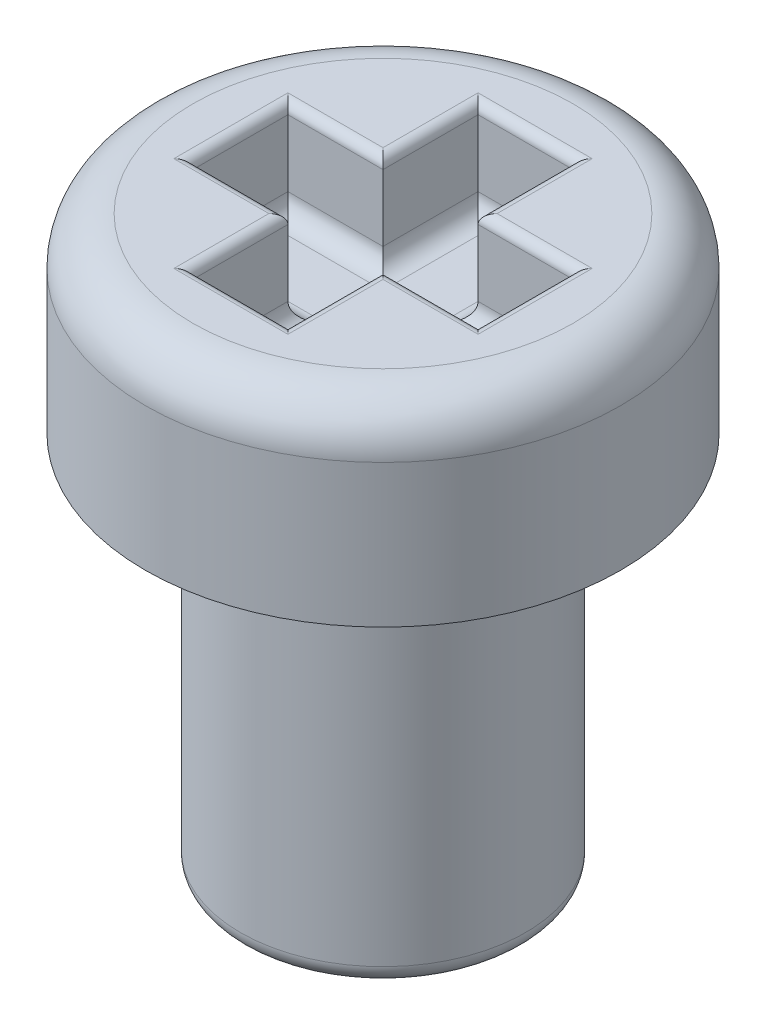
ISO-10303-21;
HEADER;
FILE_DESCRIPTION(('STEP AP214'),'2;1');
FILE_NAME('part.step','',(''),(''),'','','');
FILE_SCHEMA(('AUTOMOTIVE_DESIGN { 1 0 10303 214 1 1 1 1 }'));
ENDSEC;
DATA;
#1=APPLICATION_CONTEXT('core data for automotive mechanical design processes');
#2=APPLICATION_PROTOCOL_DEFINITION('international standard','automotive_design',2000,#1);
#3=PRODUCT_CONTEXT('',#1,'mechanical');
#4=PRODUCT('Part','Part','',(#3));
#5=PRODUCT_RELATED_PRODUCT_CATEGORY('part','',(#4));
#6=PRODUCT_DEFINITION_FORMATION('','',#4);
#7=PRODUCT_DEFINITION_CONTEXT('part definition',#1,'design');
#8=PRODUCT_DEFINITION('design','',#6,#7);
#9=PRODUCT_DEFINITION_SHAPE('','',#8);
#10=(LENGTH_UNIT() NAMED_UNIT(*) SI_UNIT(.MILLI.,.METRE.));
#11=(NAMED_UNIT(*) PLANE_ANGLE_UNIT() SI_UNIT($,.RADIAN.));
#12=(NAMED_UNIT(*) SI_UNIT($,.STERADIAN.) SOLID_ANGLE_UNIT());
#13=UNCERTAINTY_MEASURE_WITH_UNIT(LENGTH_MEASURE(1.E-05),#10,'distance_accuracy_value','');
#14=(GEOMETRIC_REPRESENTATION_CONTEXT(3) GLOBAL_UNCERTAINTY_ASSIGNED_CONTEXT((#13)) GLOBAL_UNIT_ASSIGNED_CONTEXT((#10,
#11,#12)) REPRESENTATION_CONTEXT('',''));
#15=CARTESIAN_POINT('',(0.,0.,0.));
#16=DIRECTION('',(0.,0.,1.));
#17=DIRECTION('',(1.,0.,0.));
#18=AXIS2_PLACEMENT_3D('',#15,#16,#17);
#19=CARTESIAN_POINT('',(0.,4.,0.));
#20=DIRECTION('',(0.,-1.,0.));
#21=DIRECTION('',(0.,0.,-1.));
#22=AXIS2_PLACEMENT_3D('',#19,#20,#21);
#23=CYLINDRICAL_SURFACE('',#22,1.5);
#24=CARTESIAN_POINT('',(0.,0.2,0.));
#25=DIRECTION('',(0.,1.,0.));
#26=DIRECTION('',(0.,0.,1.));
#27=AXIS2_PLACEMENT_3D('',#24,#25,#26);
#28=CIRCLE('',#27,1.5);
#29=CARTESIAN_POINT('',(0.,0.2,1.5));
#30=VERTEX_POINT('',#29);
#31=EDGE_CURVE('E252',#30,#30,#28,.T.);
#32=ORIENTED_EDGE('',*,*,#31,.T.);
#33=EDGE_LOOP('',(#32));
#34=FACE_BOUND('',#33,.T.);
#35=CARTESIAN_POINT('',(0.,4.,0.));
#36=DIRECTION('',(0.,1.,0.));
#37=DIRECTION('',(0.,0.,1.));
#38=AXIS2_PLACEMENT_3D('',#35,#36,#37);
#39=CIRCLE('',#38,1.5);
#40=CARTESIAN_POINT('',(0.,4.,1.5));
#41=VERTEX_POINT('',#40);
#42=EDGE_CURVE('E626',#41,#41,#39,.T.);
#43=ORIENTED_EDGE('',*,*,#42,.F.);
#44=EDGE_LOOP('',(#43));
#45=FACE_BOUND('',#44,.T.);
#46=ADVANCED_FACE('F39',(#34,#45),#23,.T.);
#47=CARTESIAN_POINT('',(0.,0.,0.));
#48=DIRECTION('',(0.,1.,0.));
#49=DIRECTION('',(0.,0.,1.));
#50=AXIS2_PLACEMENT_3D('',#47,#48,#49);
#51=PLANE('',#50);
#52=CARTESIAN_POINT('',(0.,0.,0.));
#53=DIRECTION('',(0.,1.,0.));
#54=DIRECTION('',(0.,0.,1.));
#55=AXIS2_PLACEMENT_3D('',#52,#53,#54);
#56=CIRCLE('',#55,1.3);
#57=CARTESIAN_POINT('',(0.,0.,1.3));
#58=VERTEX_POINT('',#57);
#59=EDGE_CURVE('E245',#58,#58,#56,.F.);
#60=ORIENTED_EDGE('',*,*,#59,.T.);
#61=EDGE_LOOP('',(#60));
#62=FACE_BOUND('',#61,.T.);
#63=ADVANCED_FACE('F499',(#62),#51,.F.);
#64=CARTESIAN_POINT('',(0.,0.2,0.));
#65=DIRECTION('',(0.,1.,0.));
#66=DIRECTION('',(0.,0.,1.));
#67=AXIS2_PLACEMENT_3D('',#64,#65,#66);
#68=TOROIDAL_SURFACE('',#67,1.3,0.2);
#69=ORIENTED_EDGE('',*,*,#59,.F.);
#70=EDGE_LOOP('',(#69));
#71=FACE_BOUND('',#70,.T.);
#72=ORIENTED_EDGE('',*,*,#31,.F.);
#73=EDGE_LOOP('',(#72));
#74=FACE_BOUND('',#73,.T.);
#75=ADVANCED_FACE('F505',(#71,#74),#68,.T.);
#76=CARTESIAN_POINT('',(0.,4.,0.));
#77=DIRECTION('',(0.,1.,0.));
#78=DIRECTION('',(0.,0.,1.));
#79=AXIS2_PLACEMENT_3D('',#76,#77,#78);
#80=PLANE('',#79);
#81=ORIENTED_EDGE('',*,*,#42,.T.);
#82=EDGE_LOOP('',(#81));
#83=FACE_BOUND('',#82,.T.);
#84=CARTESIAN_POINT('',(0.,4.,0.));
#85=DIRECTION('',(0.,-1.,0.));
#86=DIRECTION('',(0.,0.,-1.));
#87=AXIS2_PLACEMENT_3D('',#84,#85,#86);
#88=CIRCLE('',#87,2.5);
#89=CARTESIAN_POINT('',(0.,4.,-2.5));
#90=VERTEX_POINT('',#89);
#91=EDGE_CURVE('E621',#90,#90,#88,.T.);
#92=ORIENTED_EDGE('',*,*,#91,.T.);
#93=EDGE_LOOP('',(#92));
#94=FACE_BOUND('',#93,.T.);
#95=ADVANCED_FACE('F514',(#83,#94),#80,.F.);
#96=CARTESIAN_POINT('',(0.,0.,0.));
#97=DIRECTION('',(0.,-1.,0.));
#98=DIRECTION('',(0.,0.,-1.));
#99=AXIS2_PLACEMENT_3D('',#96,#97,#98);
#100=CYLINDRICAL_SURFACE('',#99,2.5);
#101=CARTESIAN_POINT('',(0.,5.5,0.));
#102=DIRECTION('',(0.,-1.,0.));
#103=DIRECTION('',(0.,0.,-1.));
#104=AXIS2_PLACEMENT_3D('',#101,#102,#103);
#105=CIRCLE('',#104,2.5);
#106=CARTESIAN_POINT('',(0.,5.5,-2.5));
#107=VERTEX_POINT('',#106);
#108=EDGE_CURVE('E48',#107,#107,#105,.T.);
#109=ORIENTED_EDGE('',*,*,#108,.T.);
#110=EDGE_LOOP('',(#109));
#111=FACE_BOUND('',#110,.T.);
#112=ORIENTED_EDGE('',*,*,#91,.F.);
#113=EDGE_LOOP('',(#112));
#114=FACE_BOUND('',#113,.T.);
#115=ADVANCED_FACE('F485',(#111,#114),#100,.T.);
#116=CARTESIAN_POINT('',(-2.5,6.,0.));
#117=DIRECTION('',(0.,-1.,0.));
#118=DIRECTION('',(0.,0.,-1.));
#119=AXIS2_PLACEMENT_3D('',#116,#117,#118);
#120=PLANE('',#119);
#121=CARTESIAN_POINT('',(0.,6.,0.));
#122=DIRECTION('',(0.,-1.,0.));
#123=DIRECTION('',(0.,0.,-1.));
#124=AXIS2_PLACEMENT_3D('',#121,#122,#123);
#125=CIRCLE('',#124,2.);
#126=CARTESIAN_POINT('',(0.,6.,-2.));
#127=VERTEX_POINT('',#126);
#128=EDGE_CURVE('E11',#127,#127,#125,.F.);
#129=ORIENTED_EDGE('',*,*,#128,.T.);
#130=EDGE_LOOP('',(#129));
#131=FACE_BOUND('',#130,.T.);
#132=DIRECTION('',(0.,0.,1.));
#133=VECTOR('',#132,1.);
#134=CARTESIAN_POINT('',(-0.6,6.,0.));
#135=LINE('',#134,#133);
#136=CARTESIAN_POINT('',(-0.6,6.,1.6));
#137=VERTEX_POINT('',#136);
#138=CARTESIAN_POINT('',(-0.6,6.,0.6));
#139=VERTEX_POINT('',#138);
#140=EDGE_CURVE('E282',#137,#139,#135,.F.);
#141=ORIENTED_EDGE('',*,*,#140,.T.);
#142=DIRECTION('',(1.,0.,0.));
#143=VECTOR('',#142,1.);
#144=CARTESIAN_POINT('',(-2.5,6.,0.6));
#145=LINE('',#144,#143);
#146=CARTESIAN_POINT('',(-1.6,6.,0.6));
#147=VERTEX_POINT('',#146);
#148=EDGE_CURVE('E226',#139,#147,#145,.F.);
#149=ORIENTED_EDGE('',*,*,#148,.T.);
#150=DIRECTION('',(0.,0.,1.));
#151=VECTOR('',#150,1.);
#152=CARTESIAN_POINT('',(-1.6,6.,0.));
#153=LINE('',#152,#151);
#154=CARTESIAN_POINT('',(-1.6,6.,-0.6));
#155=VERTEX_POINT('',#154);
#156=EDGE_CURVE('E244',#147,#155,#153,.F.);
#157=ORIENTED_EDGE('',*,*,#156,.T.);
#158=DIRECTION('',(-1.,0.,0.));
#159=VECTOR('',#158,1.);
#160=CARTESIAN_POINT('',(-2.5,6.,-0.6));
#161=LINE('',#160,#159);
#162=CARTESIAN_POINT('',(-0.6,6.,-0.6));
#163=VERTEX_POINT('',#162);
#164=EDGE_CURVE('E249',#155,#163,#161,.F.);
#165=ORIENTED_EDGE('',*,*,#164,.T.);
#166=DIRECTION('',(0.,0.,1.));
#167=VECTOR('',#166,1.);
#168=CARTESIAN_POINT('',(-0.6,6.,0.));
#169=LINE('',#168,#167);
#170=CARTESIAN_POINT('',(-0.6,6.,-1.6));
#171=VERTEX_POINT('',#170);
#172=EDGE_CURVE('E258',#163,#171,#169,.F.);
#173=ORIENTED_EDGE('',*,*,#172,.T.);
#174=DIRECTION('',(-1.,0.,0.));
#175=VECTOR('',#174,1.);
#176=CARTESIAN_POINT('',(-2.5,6.,-1.6));
#177=LINE('',#176,#175);
#178=CARTESIAN_POINT('',(0.6,6.,-1.6));
#179=VERTEX_POINT('',#178);
#180=EDGE_CURVE('E261',#171,#179,#177,.F.);
#181=ORIENTED_EDGE('',*,*,#180,.T.);
#182=DIRECTION('',(0.,0.,-1.));
#183=VECTOR('',#182,1.);
#184=CARTESIAN_POINT('',(0.6,6.,0.));
#185=LINE('',#184,#183);
#186=CARTESIAN_POINT('',(0.6,6.,-0.6));
#187=VERTEX_POINT('',#186);
#188=EDGE_CURVE('E264',#179,#187,#185,.F.);
#189=ORIENTED_EDGE('',*,*,#188,.T.);
#190=DIRECTION('',(-1.,0.,0.));
#191=VECTOR('',#190,1.);
#192=CARTESIAN_POINT('',(-2.5,6.,-0.599999999999999));
#193=LINE('',#192,#191);
#194=CARTESIAN_POINT('',(1.6,6.,-0.6));
#195=VERTEX_POINT('',#194);
#196=EDGE_CURVE('E267',#187,#195,#193,.F.);
#197=ORIENTED_EDGE('',*,*,#196,.T.);
#198=DIRECTION('',(0.,0.,-1.));
#199=VECTOR('',#198,1.);
#200=CARTESIAN_POINT('',(1.6,6.,0.));
#201=LINE('',#200,#199);
#202=CARTESIAN_POINT('',(1.6,6.,0.6));
#203=VERTEX_POINT('',#202);
#204=EDGE_CURVE('E270',#195,#203,#201,.F.);
#205=ORIENTED_EDGE('',*,*,#204,.T.);
#206=DIRECTION('',(1.,0.,0.));
#207=VECTOR('',#206,1.);
#208=CARTESIAN_POINT('',(-2.5,6.,0.6));
#209=LINE('',#208,#207);
#210=CARTESIAN_POINT('',(0.6,6.,0.6));
#211=VERTEX_POINT('',#210);
#212=EDGE_CURVE('E273',#203,#211,#209,.F.);
#213=ORIENTED_EDGE('',*,*,#212,.T.);
#214=DIRECTION('',(0.,0.,-1.));
#215=VECTOR('',#214,1.);
#216=CARTESIAN_POINT('',(0.6,6.,0.));
#217=LINE('',#216,#215);
#218=CARTESIAN_POINT('',(0.6,6.,1.6));
#219=VERTEX_POINT('',#218);
#220=EDGE_CURVE('E276',#211,#219,#217,.F.);
#221=ORIENTED_EDGE('',*,*,#220,.T.);
#222=DIRECTION('',(1.,0.,0.));
#223=VECTOR('',#222,1.);
#224=CARTESIAN_POINT('',(-2.5,6.,1.6));
#225=LINE('',#224,#223);
#226=EDGE_CURVE('E279',#219,#137,#225,.F.);
#227=ORIENTED_EDGE('',*,*,#226,.T.);
#228=EDGE_LOOP('',(#141,#149,#157,#165,#173,#181,#189,#197,#205,#213,#221,#227));
#229=FACE_BOUND('',#228,.T.);
#230=ADVANCED_FACE('F666',(#131,#229),#120,.F.);
#231=CARTESIAN_POINT('',(0.5,5.,0.5));
#232=DIRECTION('',(1.,0.,0.));
#233=DIRECTION('',(0.,0.,-1.));
#234=AXIS2_PLACEMENT_3D('',#231,#232,#233);
#235=PLANE('',#234);
#236=DIRECTION('',(0.,1.,0.));
#237=VECTOR('',#236,1.);
#238=CARTESIAN_POINT('',(0.5,5.,0.5));
#239=LINE('',#238,#237);
#240=CARTESIAN_POINT('',(0.5,5.2,0.5));
#241=VERTEX_POINT('',#240);
#242=CARTESIAN_POINT('',(0.5,5.9,0.5));
#243=VERTEX_POINT('',#242);
#244=EDGE_CURVE('E366',#241,#243,#239,.T.);
#245=ORIENTED_EDGE('',*,*,#244,.F.);
#246=DIRECTION('',(0.,0.,-1.));
#247=VECTOR('',#246,1.);
#248=CARTESIAN_POINT('',(0.5,5.2,0.5));
#249=LINE('',#248,#247);
#250=CARTESIAN_POINT('',(0.5,5.2,1.5));
#251=VERTEX_POINT('',#250);
#252=EDGE_CURVE('E415',#241,#251,#249,.F.);
#253=ORIENTED_EDGE('',*,*,#252,.T.);
#254=DIRECTION('',(0.,1.,0.));
#255=VECTOR('',#254,1.);
#256=CARTESIAN_POINT('',(0.5,5.,1.5));
#257=LINE('',#256,#255);
#258=CARTESIAN_POINT('',(0.5,5.9,1.5));
#259=VERTEX_POINT('',#258);
#260=EDGE_CURVE('E616',#251,#259,#257,.T.);
#261=ORIENTED_EDGE('',*,*,#260,.T.);
#262=DIRECTION('',(0.,0.,-1.));
#263=VECTOR('',#262,1.);
#264=CARTESIAN_POINT('',(0.5,5.9,0.5));
#265=LINE('',#264,#263);
#266=EDGE_CURVE('E290',#259,#243,#265,.T.);
#267=ORIENTED_EDGE('',*,*,#266,.T.);
#268=EDGE_LOOP('',(#245,#253,#261,#267));
#269=FACE_BOUND('',#268,.T.);
#270=ADVANCED_FACE('F615',(#269),#235,.F.);
#271=CARTESIAN_POINT('',(-0.5,5.,1.5));
#272=DIRECTION('',(0.,0.,1.));
#273=DIRECTION('',(1.,0.,0.));
#274=AXIS2_PLACEMENT_3D('',#271,#272,#273);
#275=PLANE('',#274);
#276=ORIENTED_EDGE('',*,*,#260,.F.);
#277=DIRECTION('',(1.,0.,0.));
#278=VECTOR('',#277,1.);
#279=CARTESIAN_POINT('',(-0.5,5.2,1.5));
#280=LINE('',#279,#278);
#281=CARTESIAN_POINT('',(-0.5,5.2,1.5));
#282=VERTEX_POINT('',#281);
#283=EDGE_CURVE('E418',#251,#282,#280,.F.);
#284=ORIENTED_EDGE('',*,*,#283,.T.);
#285=DIRECTION('',(0.,1.,0.));
#286=VECTOR('',#285,1.);
#287=CARTESIAN_POINT('',(-0.5,5.,1.5));
#288=LINE('',#287,#286);
#289=CARTESIAN_POINT('',(-0.5,5.9,1.5));
#290=VERTEX_POINT('',#289);
#291=EDGE_CURVE('E215',#282,#290,#288,.T.);
#292=ORIENTED_EDGE('',*,*,#291,.T.);
#293=DIRECTION('',(1.,0.,0.));
#294=VECTOR('',#293,1.);
#295=CARTESIAN_POINT('',(-0.5,5.9,1.5));
#296=LINE('',#295,#294);
#297=EDGE_CURVE('E238',#290,#259,#296,.T.);
#298=ORIENTED_EDGE('',*,*,#297,.T.);
#299=EDGE_LOOP('',(#276,#284,#292,#298));
#300=FACE_BOUND('',#299,.T.);
#301=ADVANCED_FACE('F618',(#300),#275,.F.);
#302=CARTESIAN_POINT('',(-0.5,5.,0.5));
#303=DIRECTION('',(-1.,0.,0.));
#304=DIRECTION('',(0.,0.,1.));
#305=AXIS2_PLACEMENT_3D('',#302,#303,#304);
#306=PLANE('',#305);
#307=ORIENTED_EDGE('',*,*,#291,.F.);
#308=DIRECTION('',(0.,0.,1.));
#309=VECTOR('',#308,1.);
#310=CARTESIAN_POINT('',(-0.5,5.2,0.5));
#311=LINE('',#310,#309);
#312=CARTESIAN_POINT('',(-0.5,5.2,0.5));
#313=VERTEX_POINT('',#312);
#314=EDGE_CURVE('E210',#282,#313,#311,.F.);
#315=ORIENTED_EDGE('',*,*,#314,.T.);
#316=DIRECTION('',(0.,1.,0.));
#317=VECTOR('',#316,1.);
#318=CARTESIAN_POINT('',(-0.5,5.,0.5));
#319=LINE('',#318,#317);
#320=CARTESIAN_POINT('',(-0.5,5.9,0.5));
#321=VERTEX_POINT('',#320);
#322=EDGE_CURVE('E202',#313,#321,#319,.T.);
#323=ORIENTED_EDGE('',*,*,#322,.T.);
#324=DIRECTION('',(0.,0.,1.));
#325=VECTOR('',#324,1.);
#326=CARTESIAN_POINT('',(-0.5,5.9,0.5));
#327=LINE('',#326,#325);
#328=EDGE_CURVE('E207',#321,#290,#327,.T.);
#329=ORIENTED_EDGE('',*,*,#328,.T.);
#330=EDGE_LOOP('',(#307,#315,#323,#329));
#331=FACE_BOUND('',#330,.T.);
#332=ADVANCED_FACE('F205',(#331),#306,.F.);
#333=CARTESIAN_POINT('',(-0.5,5.,0.5));
#334=DIRECTION('',(0.,0.,1.));
#335=DIRECTION('',(1.,0.,0.));
#336=AXIS2_PLACEMENT_3D('',#333,#334,#335);
#337=PLANE('',#336);
#338=ORIENTED_EDGE('',*,*,#322,.F.);
#339=DIRECTION('',(1.,0.,0.));
#340=VECTOR('',#339,1.);
#341=CARTESIAN_POINT('',(-0.5,5.2,0.5));
#342=LINE('',#341,#340);
#343=CARTESIAN_POINT('',(-1.5,5.2,0.5));
#344=VERTEX_POINT('',#343);
#345=EDGE_CURVE('E410',#313,#344,#342,.F.);
#346=ORIENTED_EDGE('',*,*,#345,.T.);
#347=DIRECTION('',(0.,1.,0.));
#348=VECTOR('',#347,1.);
#349=CARTESIAN_POINT('',(-1.5,5.,0.5));
#350=LINE('',#349,#348);
#351=CARTESIAN_POINT('',(-1.5,5.9,0.5));
#352=VERTEX_POINT('',#351);
#353=EDGE_CURVE('E216',#344,#352,#350,.T.);
#354=ORIENTED_EDGE('',*,*,#353,.T.);
#355=DIRECTION('',(1.,0.,0.));
#356=VECTOR('',#355,1.);
#357=CARTESIAN_POINT('',(-0.5,5.9,0.5));
#358=LINE('',#357,#356);
#359=EDGE_CURVE('E224',#352,#321,#358,.T.);
#360=ORIENTED_EDGE('',*,*,#359,.T.);
#361=EDGE_LOOP('',(#338,#346,#354,#360));
#362=FACE_BOUND('',#361,.T.);
#363=ADVANCED_FACE('F240',(#362),#337,.F.);
#364=CARTESIAN_POINT('',(-1.5,5.,-0.5));
#365=DIRECTION('',(-1.,0.,0.));
#366=DIRECTION('',(0.,0.,1.));
#367=AXIS2_PLACEMENT_3D('',#364,#365,#366);
#368=PLANE('',#367);
#369=ORIENTED_EDGE('',*,*,#353,.F.);
#370=DIRECTION('',(0.,0.,1.));
#371=VECTOR('',#370,1.);
#372=CARTESIAN_POINT('',(-1.5,5.2,-0.5));
#373=LINE('',#372,#371);
#374=CARTESIAN_POINT('',(-1.5,5.2,-0.5));
#375=VERTEX_POINT('',#374);
#376=EDGE_CURVE('E407',#344,#375,#373,.F.);
#377=ORIENTED_EDGE('',*,*,#376,.T.);
#378=DIRECTION('',(0.,1.,0.));
#379=VECTOR('',#378,1.);
#380=CARTESIAN_POINT('',(-1.5,5.,-0.5));
#381=LINE('',#380,#379);
#382=CARTESIAN_POINT('',(-1.5,5.9,-0.5));
#383=VERTEX_POINT('',#382);
#384=EDGE_CURVE('E632',#375,#383,#381,.T.);
#385=ORIENTED_EDGE('',*,*,#384,.T.);
#386=DIRECTION('',(0.,0.,1.));
#387=VECTOR('',#386,1.);
#388=CARTESIAN_POINT('',(-1.5,5.9,-0.5));
#389=LINE('',#388,#387);
#390=EDGE_CURVE('E322',#383,#352,#389,.T.);
#391=ORIENTED_EDGE('',*,*,#390,.T.);
#392=EDGE_LOOP('',(#369,#377,#385,#391));
#393=FACE_BOUND('',#392,.T.);
#394=ADVANCED_FACE('F701',(#393),#368,.F.);
#395=CARTESIAN_POINT('',(-0.5,5.,-0.5));
#396=DIRECTION('',(0.,0.,-1.));
#397=DIRECTION('',(-1.,0.,0.));
#398=AXIS2_PLACEMENT_3D('',#395,#396,#397);
#399=PLANE('',#398);
#400=ORIENTED_EDGE('',*,*,#384,.F.);
#401=DIRECTION('',(-1.,0.,0.));
#402=VECTOR('',#401,1.);
#403=CARTESIAN_POINT('',(-0.5,5.2,-0.5));
#404=LINE('',#403,#402);
#405=CARTESIAN_POINT('',(-0.5,5.2,-0.5));
#406=VERTEX_POINT('',#405);
#407=EDGE_CURVE('E403',#375,#406,#404,.F.);
#408=ORIENTED_EDGE('',*,*,#407,.T.);
#409=DIRECTION('',(0.,1.,0.));
#410=VECTOR('',#409,1.);
#411=CARTESIAN_POINT('',(-0.5,5.,-0.5));
#412=LINE('',#411,#410);
#413=CARTESIAN_POINT('',(-0.5,5.9,-0.5));
#414=VERTEX_POINT('',#413);
#415=EDGE_CURVE('E635',#406,#414,#412,.T.);
#416=ORIENTED_EDGE('',*,*,#415,.T.);
#417=DIRECTION('',(-1.,0.,0.));
#418=VECTOR('',#417,1.);
#419=CARTESIAN_POINT('',(-0.5,5.9,-0.5));
#420=LINE('',#419,#418);
#421=EDGE_CURVE('E318',#414,#383,#420,.T.);
#422=ORIENTED_EDGE('',*,*,#421,.T.);
#423=EDGE_LOOP('',(#400,#408,#416,#422));
#424=FACE_BOUND('',#423,.T.);
#425=ADVANCED_FACE('F698',(#424),#399,.F.);
#426=CARTESIAN_POINT('',(-0.5,5.,-1.5));
#427=DIRECTION('',(-1.,0.,0.));
#428=DIRECTION('',(0.,0.,1.));
#429=AXIS2_PLACEMENT_3D('',#426,#427,#428);
#430=PLANE('',#429);
#431=ORIENTED_EDGE('',*,*,#415,.F.);
#432=DIRECTION('',(0.,0.,1.));
#433=VECTOR('',#432,1.);
#434=CARTESIAN_POINT('',(-0.5,5.2,-1.5));
#435=LINE('',#434,#433);
#436=CARTESIAN_POINT('',(-0.5,5.2,-1.5));
#437=VERTEX_POINT('',#436);
#438=EDGE_CURVE('E55',#406,#437,#435,.F.);
#439=ORIENTED_EDGE('',*,*,#438,.T.);
#440=DIRECTION('',(0.,1.,0.));
#441=VECTOR('',#440,1.);
#442=CARTESIAN_POINT('',(-0.5,5.,-1.5));
#443=LINE('',#442,#441);
#444=CARTESIAN_POINT('',(-0.5,5.9,-1.5));
#445=VERTEX_POINT('',#444);
#446=EDGE_CURVE('E638',#437,#445,#443,.T.);
#447=ORIENTED_EDGE('',*,*,#446,.T.);
#448=DIRECTION('',(0.,0.,1.));
#449=VECTOR('',#448,1.);
#450=CARTESIAN_POINT('',(-0.5,5.9,-1.5));
#451=LINE('',#450,#449);
#452=EDGE_CURVE('E314',#445,#414,#451,.T.);
#453=ORIENTED_EDGE('',*,*,#452,.T.);
#454=EDGE_LOOP('',(#431,#439,#447,#453));
#455=FACE_BOUND('',#454,.T.);
#456=ADVANCED_FACE('F695',(#455),#430,.F.);
#457=CARTESIAN_POINT('',(-0.5,5.,-1.5));
#458=DIRECTION('',(0.,0.,-1.));
#459=DIRECTION('',(-1.,0.,0.));
#460=AXIS2_PLACEMENT_3D('',#457,#458,#459);
#461=PLANE('',#460);
#462=ORIENTED_EDGE('',*,*,#446,.F.);
#463=DIRECTION('',(-1.,0.,0.));
#464=VECTOR('',#463,1.);
#465=CARTESIAN_POINT('',(-0.5,5.2,-1.5));
#466=LINE('',#465,#464);
#467=CARTESIAN_POINT('',(0.5,5.2,-1.5));
#468=VERTEX_POINT('',#467);
#469=EDGE_CURVE('E62',#437,#468,#466,.F.);
#470=ORIENTED_EDGE('',*,*,#469,.T.);
#471=DIRECTION('',(0.,1.,0.));
#472=VECTOR('',#471,1.);
#473=CARTESIAN_POINT('',(0.5,5.,-1.5));
#474=LINE('',#473,#472);
#475=CARTESIAN_POINT('',(0.5,5.9,-1.5));
#476=VERTEX_POINT('',#475);
#477=EDGE_CURVE('E641',#468,#476,#474,.T.);
#478=ORIENTED_EDGE('',*,*,#477,.T.);
#479=DIRECTION('',(-1.,0.,0.));
#480=VECTOR('',#479,1.);
#481=CARTESIAN_POINT('',(-0.5,5.9,-1.5));
#482=LINE('',#481,#480);
#483=EDGE_CURVE('E310',#476,#445,#482,.T.);
#484=ORIENTED_EDGE('',*,*,#483,.T.);
#485=EDGE_LOOP('',(#462,#470,#478,#484));
#486=FACE_BOUND('',#485,.T.);
#487=ADVANCED_FACE('F691',(#486),#461,.F.);
#488=CARTESIAN_POINT('',(0.5,5.,-1.5));
#489=DIRECTION('',(1.,0.,0.));
#490=DIRECTION('',(0.,0.,-1.));
#491=AXIS2_PLACEMENT_3D('',#488,#489,#490);
#492=PLANE('',#491);
#493=ORIENTED_EDGE('',*,*,#477,.F.);
#494=DIRECTION('',(0.,0.,-1.));
#495=VECTOR('',#494,1.);
#496=CARTESIAN_POINT('',(0.5,5.2,-1.5));
#497=LINE('',#496,#495);
#498=CARTESIAN_POINT('',(0.5,5.2,-0.5));
#499=VERTEX_POINT('',#498);
#500=EDGE_CURVE('E430',#468,#499,#497,.F.);
#501=ORIENTED_EDGE('',*,*,#500,.T.);
#502=DIRECTION('',(0.,1.,0.));
#503=VECTOR('',#502,1.);
#504=CARTESIAN_POINT('',(0.5,5.,-0.5));
#505=LINE('',#504,#503);
#506=CARTESIAN_POINT('',(0.5,5.9,-0.5));
#507=VERTEX_POINT('',#506);
#508=EDGE_CURVE('E644',#499,#507,#505,.T.);
#509=ORIENTED_EDGE('',*,*,#508,.T.);
#510=DIRECTION('',(0.,0.,-1.));
#511=VECTOR('',#510,1.);
#512=CARTESIAN_POINT('',(0.5,5.9,-1.5));
#513=LINE('',#512,#511);
#514=EDGE_CURVE('E306',#507,#476,#513,.T.);
#515=ORIENTED_EDGE('',*,*,#514,.T.);
#516=EDGE_LOOP('',(#493,#501,#509,#515));
#517=FACE_BOUND('',#516,.T.);
#518=ADVANCED_FACE('F687',(#517),#492,.F.);
#519=CARTESIAN_POINT('',(1.5,5.,-0.5));
#520=DIRECTION('',(0.,0.,-1.));
#521=DIRECTION('',(-1.,0.,0.));
#522=AXIS2_PLACEMENT_3D('',#519,#520,#521);
#523=PLANE('',#522);
#524=ORIENTED_EDGE('',*,*,#508,.F.);
#525=DIRECTION('',(-1.,0.,0.));
#526=VECTOR('',#525,1.);
#527=CARTESIAN_POINT('',(1.5,5.2,-0.5));
#528=LINE('',#527,#526);
#529=CARTESIAN_POINT('',(1.5,5.2,-0.5));
#530=VERTEX_POINT('',#529);
#531=EDGE_CURVE('E427',#499,#530,#528,.F.);
#532=ORIENTED_EDGE('',*,*,#531,.T.);
#533=DIRECTION('',(0.,1.,0.));
#534=VECTOR('',#533,1.);
#535=CARTESIAN_POINT('',(1.5,5.,-0.5));
#536=LINE('',#535,#534);
#537=CARTESIAN_POINT('',(1.5,5.9,-0.5));
#538=VERTEX_POINT('',#537);
#539=EDGE_CURVE('E647',#530,#538,#536,.T.);
#540=ORIENTED_EDGE('',*,*,#539,.T.);
#541=DIRECTION('',(-1.,0.,0.));
#542=VECTOR('',#541,1.);
#543=CARTESIAN_POINT('',(1.5,5.9,-0.5));
#544=LINE('',#543,#542);
#545=EDGE_CURVE('E302',#538,#507,#544,.T.);
#546=ORIENTED_EDGE('',*,*,#545,.T.);
#547=EDGE_LOOP('',(#524,#532,#540,#546));
#548=FACE_BOUND('',#547,.T.);
#549=ADVANCED_FACE('F683',(#548),#523,.F.);
#550=CARTESIAN_POINT('',(1.5,5.,-0.5));
#551=DIRECTION('',(1.,0.,0.));
#552=DIRECTION('',(0.,0.,-1.));
#553=AXIS2_PLACEMENT_3D('',#550,#551,#552);
#554=PLANE('',#553);
#555=ORIENTED_EDGE('',*,*,#539,.F.);
#556=DIRECTION('',(0.,0.,-1.));
#557=VECTOR('',#556,1.);
#558=CARTESIAN_POINT('',(1.5,5.2,-0.5));
#559=LINE('',#558,#557);
#560=CARTESIAN_POINT('',(1.5,5.2,0.5));
#561=VERTEX_POINT('',#560);
#562=EDGE_CURVE('E424',#530,#561,#559,.F.);
#563=ORIENTED_EDGE('',*,*,#562,.T.);
#564=DIRECTION('',(0.,1.,0.));
#565=VECTOR('',#564,1.);
#566=CARTESIAN_POINT('',(1.5,5.,0.5));
#567=LINE('',#566,#565);
#568=CARTESIAN_POINT('',(1.5,5.9,0.5));
#569=VERTEX_POINT('',#568);
#570=EDGE_CURVE('E650',#561,#569,#567,.T.);
#571=ORIENTED_EDGE('',*,*,#570,.T.);
#572=DIRECTION('',(0.,0.,-1.));
#573=VECTOR('',#572,1.);
#574=CARTESIAN_POINT('',(1.5,5.9,-0.5));
#575=LINE('',#574,#573);
#576=EDGE_CURVE('E298',#569,#538,#575,.T.);
#577=ORIENTED_EDGE('',*,*,#576,.T.);
#578=EDGE_LOOP('',(#555,#563,#571,#577));
#579=FACE_BOUND('',#578,.T.);
#580=ADVANCED_FACE('F679',(#579),#554,.F.);
#581=CARTESIAN_POINT('',(1.5,5.,0.5));
#582=DIRECTION('',(0.,0.,1.));
#583=DIRECTION('',(1.,0.,0.));
#584=AXIS2_PLACEMENT_3D('',#581,#582,#583);
#585=PLANE('',#584);
#586=ORIENTED_EDGE('',*,*,#570,.F.);
#587=DIRECTION('',(1.,0.,0.));
#588=VECTOR('',#587,1.);
#589=CARTESIAN_POINT('',(1.5,5.2,0.5));
#590=LINE('',#589,#588);
#591=EDGE_CURVE('E421',#561,#241,#590,.F.);
#592=ORIENTED_EDGE('',*,*,#591,.T.);
#593=ORIENTED_EDGE('',*,*,#244,.T.);
#594=DIRECTION('',(1.,0.,0.));
#595=VECTOR('',#594,1.);
#596=CARTESIAN_POINT('',(1.5,5.9,0.5));
#597=LINE('',#596,#595);
#598=EDGE_CURVE('E294',#243,#569,#597,.T.);
#599=ORIENTED_EDGE('',*,*,#598,.T.);
#600=EDGE_LOOP('',(#586,#592,#593,#599));
#601=FACE_BOUND('',#600,.T.);
#602=ADVANCED_FACE('F676',(#601),#585,.F.);
#603=CARTESIAN_POINT('',(0.,5.,0.));
#604=DIRECTION('',(0.,1.,0.));
#605=DIRECTION('',(0.,0.,1.));
#606=AXIS2_PLACEMENT_3D('',#603,#604,#605);
#607=PLANE('',#606);
#608=DIRECTION('',(-1.,0.,0.));
#609=VECTOR('',#608,1.);
#610=CARTESIAN_POINT('',(0.,5.,-0.3));
#611=LINE('',#610,#609);
#612=CARTESIAN_POINT('',(-0.3,5.,-0.3));
#613=VERTEX_POINT('',#612);
#614=CARTESIAN_POINT('',(-1.3,5.,-0.3));
#615=VERTEX_POINT('',#614);
#616=EDGE_CURVE('E387',#613,#615,#611,.T.);
#617=ORIENTED_EDGE('',*,*,#616,.T.);
#618=DIRECTION('',(0.,0.,1.));
#619=VECTOR('',#618,1.);
#620=CARTESIAN_POINT('',(-1.3,5.,0.));
#621=LINE('',#620,#619);
#622=CARTESIAN_POINT('',(-1.3,5.,0.3));
#623=VERTEX_POINT('',#622);
#624=EDGE_CURVE('E400',#615,#623,#621,.T.);
#625=ORIENTED_EDGE('',*,*,#624,.T.);
#626=DIRECTION('',(1.,0.,0.));
#627=VECTOR('',#626,1.);
#628=CARTESIAN_POINT('',(0.,5.,0.3));
#629=LINE('',#628,#627);
#630=CARTESIAN_POINT('',(-0.3,5.,0.3));
#631=VERTEX_POINT('',#630);
#632=EDGE_CURVE('E397',#623,#631,#629,.T.);
#633=ORIENTED_EDGE('',*,*,#632,.T.);
#634=DIRECTION('',(0.,0.,1.));
#635=VECTOR('',#634,1.);
#636=CARTESIAN_POINT('',(-0.3,5.,0.));
#637=LINE('',#636,#635);
#638=CARTESIAN_POINT('',(-0.3,5.,1.3));
#639=VERTEX_POINT('',#638);
#640=EDGE_CURVE('E394',#631,#639,#637,.T.);
#641=ORIENTED_EDGE('',*,*,#640,.T.);
#642=DIRECTION('',(1.,0.,0.));
#643=VECTOR('',#642,1.);
#644=CARTESIAN_POINT('',(0.,5.,1.3));
#645=LINE('',#644,#643);
#646=CARTESIAN_POINT('',(0.3,5.,1.3));
#647=VERTEX_POINT('',#646);
#648=EDGE_CURVE('E391',#639,#647,#645,.T.);
#649=ORIENTED_EDGE('',*,*,#648,.T.);
#650=DIRECTION('',(0.,0.,-1.));
#651=VECTOR('',#650,1.);
#652=CARTESIAN_POINT('',(0.3,5.,0.));
#653=LINE('',#652,#651);
#654=CARTESIAN_POINT('',(0.3,5.,0.3));
#655=VERTEX_POINT('',#654);
#656=EDGE_CURVE('E384',#647,#655,#653,.T.);
#657=ORIENTED_EDGE('',*,*,#656,.T.);
#658=DIRECTION('',(1.,0.,0.));
#659=VECTOR('',#658,1.);
#660=CARTESIAN_POINT('',(0.,5.,0.3));
#661=LINE('',#660,#659);
#662=CARTESIAN_POINT('',(1.3,5.,0.3));
#663=VERTEX_POINT('',#662);
#664=EDGE_CURVE('E381',#655,#663,#661,.T.);
#665=ORIENTED_EDGE('',*,*,#664,.T.);
#666=DIRECTION('',(0.,0.,-1.));
#667=VECTOR('',#666,1.);
#668=CARTESIAN_POINT('',(1.3,5.,0.));
#669=LINE('',#668,#667);
#670=CARTESIAN_POINT('',(1.3,5.,-0.3));
#671=VERTEX_POINT('',#670);
#672=EDGE_CURVE('E378',#663,#671,#669,.T.);
#673=ORIENTED_EDGE('',*,*,#672,.T.);
#674=DIRECTION('',(-1.,0.,0.));
#675=VECTOR('',#674,1.);
#676=CARTESIAN_POINT('',(0.,5.,-0.3));
#677=LINE('',#676,#675);
#678=CARTESIAN_POINT('',(0.3,5.,-0.3));
#679=VERTEX_POINT('',#678);
#680=EDGE_CURVE('E375',#671,#679,#677,.T.);
#681=ORIENTED_EDGE('',*,*,#680,.T.);
#682=DIRECTION('',(0.,0.,-1.));
#683=VECTOR('',#682,1.);
#684=CARTESIAN_POINT('',(0.3,5.,0.));
#685=LINE('',#684,#683);
#686=CARTESIAN_POINT('',(0.3,5.,-1.3));
#687=VERTEX_POINT('',#686);
#688=EDGE_CURVE('E372',#679,#687,#685,.T.);
#689=ORIENTED_EDGE('',*,*,#688,.T.);
#690=DIRECTION('',(-1.,0.,0.));
#691=VECTOR('',#690,1.);
#692=CARTESIAN_POINT('',(0.,5.,-1.3));
#693=LINE('',#692,#691);
#694=CARTESIAN_POINT('',(-0.3,5.,-1.3));
#695=VERTEX_POINT('',#694);
#696=EDGE_CURVE('E369',#687,#695,#693,.T.);
#697=ORIENTED_EDGE('',*,*,#696,.T.);
#698=DIRECTION('',(0.,0.,1.));
#699=VECTOR('',#698,1.);
#700=CARTESIAN_POINT('',(-0.3,5.,0.));
#701=LINE('',#700,#699);
#702=EDGE_CURVE('E324',#695,#613,#701,.T.);
#703=ORIENTED_EDGE('',*,*,#702,.T.);
#704=EDGE_LOOP('',(#617,#625,#633,#641,#649,#657,#665,#673,#681,#689,#697,#703));
#705=FACE_BOUND('',#704,.T.);
#706=ADVANCED_FACE('F559',(#705),#607,.T.);
#707=CARTESIAN_POINT('',(1.5,5.9,-0.6));
#708=DIRECTION('',(-1.,0.,0.));
#709=DIRECTION('',(0.,0.,1.));
#710=AXIS2_PLACEMENT_3D('',#707,#708,#709);
#711=CYLINDRICAL_SURFACE('',#710,0.1);
#712=CARTESIAN_POINT('',(1.6,5.9,-0.6));
#713=DIRECTION('',(-0.707106781186548,0.,-0.707106781186547));
#714=DIRECTION('',(0.707106781186547,0.,-0.707106781186548));
#715=AXIS2_PLACEMENT_3D('',#712,#713,#714);
#716=ELLIPSE('',#715,0.14142135623731,0.1);
#717=EDGE_CURVE('E358',#195,#538,#716,.F.);
#718=ORIENTED_EDGE('',*,*,#717,.F.);
#719=ORIENTED_EDGE('',*,*,#196,.F.);
#720=CARTESIAN_POINT('',(0.6,5.9,-0.6));
#721=DIRECTION('',(-0.707106781186548,0.,-0.707106781186547));
#722=DIRECTION('',(0.707106781186547,0.,-0.707106781186548));
#723=AXIS2_PLACEMENT_3D('',#720,#721,#722);
#724=ELLIPSE('',#723,0.14142135623731,0.1);
#725=EDGE_CURVE('E362',#507,#187,#724,.T.);
#726=ORIENTED_EDGE('',*,*,#725,.F.);
#727=ORIENTED_EDGE('',*,*,#545,.F.);
#728=EDGE_LOOP('',(#718,#719,#726,#727));
#729=FACE_BOUND('',#728,.T.);
#730=ADVANCED_FACE('F556',(#729),#711,.T.);
#731=CARTESIAN_POINT('',(0.6,5.9,-1.5));
#732=DIRECTION('',(0.,0.,-1.));
#733=DIRECTION('',(-1.,0.,0.));
#734=AXIS2_PLACEMENT_3D('',#731,#732,#733);
#735=CYLINDRICAL_SURFACE('',#734,0.1);
#736=ORIENTED_EDGE('',*,*,#725,.T.);
#737=ORIENTED_EDGE('',*,*,#188,.F.);
#738=CARTESIAN_POINT('',(0.6,5.9,-1.6));
#739=DIRECTION('',(-0.707106781186548,0.,-0.707106781186547));
#740=DIRECTION('',(0.707106781186547,0.,-0.707106781186548));
#741=AXIS2_PLACEMENT_3D('',#738,#739,#740);
#742=ELLIPSE('',#741,0.14142135623731,0.1);
#743=EDGE_CURVE('E354',#476,#179,#742,.T.);
#744=ORIENTED_EDGE('',*,*,#743,.F.);
#745=ORIENTED_EDGE('',*,*,#514,.F.);
#746=EDGE_LOOP('',(#736,#737,#744,#745));
#747=FACE_BOUND('',#746,.T.);
#748=ADVANCED_FACE('F552',(#747),#735,.T.);
#749=CARTESIAN_POINT('',(1.6,5.9,-0.5));
#750=DIRECTION('',(0.,0.,-1.));
#751=DIRECTION('',(-1.,0.,0.));
#752=AXIS2_PLACEMENT_3D('',#749,#750,#751);
#753=CYLINDRICAL_SURFACE('',#752,0.1);
#754=ORIENTED_EDGE('',*,*,#717,.T.);
#755=ORIENTED_EDGE('',*,*,#576,.F.);
#756=CARTESIAN_POINT('',(1.6,5.9,0.6));
#757=DIRECTION('',(0.707106781186547,0.,-0.707106781186547));
#758=DIRECTION('',(0.707106781186547,0.,0.707106781186547));
#759=AXIS2_PLACEMENT_3D('',#756,#757,#758);
#760=ELLIPSE('',#759,0.14142135623731,0.1);
#761=EDGE_CURVE('E350',#203,#569,#760,.F.);
#762=ORIENTED_EDGE('',*,*,#761,.F.);
#763=ORIENTED_EDGE('',*,*,#204,.F.);
#764=EDGE_LOOP('',(#754,#755,#762,#763));
#765=FACE_BOUND('',#764,.T.);
#766=ADVANCED_FACE('F548',(#765),#753,.T.);
#767=CARTESIAN_POINT('',(-0.5,5.9,-1.6));
#768=DIRECTION('',(-1.,0.,0.));
#769=DIRECTION('',(0.,0.,1.));
#770=AXIS2_PLACEMENT_3D('',#767,#768,#769);
#771=CYLINDRICAL_SURFACE('',#770,0.1);
#772=ORIENTED_EDGE('',*,*,#743,.T.);
#773=ORIENTED_EDGE('',*,*,#180,.F.);
#774=CARTESIAN_POINT('',(-0.6,5.9,-1.6));
#775=DIRECTION('',(-0.707106781186547,0.,0.707106781186547));
#776=DIRECTION('',(-0.707106781186547,0.,-0.707106781186547));
#777=AXIS2_PLACEMENT_3D('',#774,#775,#776);
#778=ELLIPSE('',#777,0.14142135623731,0.1);
#779=EDGE_CURVE('E346',#445,#171,#778,.T.);
#780=ORIENTED_EDGE('',*,*,#779,.F.);
#781=ORIENTED_EDGE('',*,*,#483,.F.);
#782=EDGE_LOOP('',(#772,#773,#780,#781));
#783=FACE_BOUND('',#782,.T.);
#784=ADVANCED_FACE('F544',(#783),#771,.T.);
#785=CARTESIAN_POINT('',(1.5,5.9,0.6));
#786=DIRECTION('',(1.,0.,0.));
#787=DIRECTION('',(0.,0.,-1.));
#788=AXIS2_PLACEMENT_3D('',#785,#786,#787);
#789=CYLINDRICAL_SURFACE('',#788,0.1);
#790=ORIENTED_EDGE('',*,*,#761,.T.);
#791=ORIENTED_EDGE('',*,*,#598,.F.);
#792=CARTESIAN_POINT('',(0.6,5.9,0.6));
#793=DIRECTION('',(0.707106781186547,0.,-0.707106781186547));
#794=DIRECTION('',(0.707106781186547,0.,0.707106781186547));
#795=AXIS2_PLACEMENT_3D('',#792,#793,#794);
#796=ELLIPSE('',#795,0.14142135623731,0.1);
#797=EDGE_CURVE('E342',#211,#243,#796,.F.);
#798=ORIENTED_EDGE('',*,*,#797,.F.);
#799=ORIENTED_EDGE('',*,*,#212,.F.);
#800=EDGE_LOOP('',(#790,#791,#798,#799));
#801=FACE_BOUND('',#800,.T.);
#802=ADVANCED_FACE('F540',(#801),#789,.T.);
#803=CARTESIAN_POINT('',(-0.6,5.9,-1.5));
#804=DIRECTION('',(0.,0.,1.));
#805=DIRECTION('',(1.,0.,0.));
#806=AXIS2_PLACEMENT_3D('',#803,#804,#805);
#807=CYLINDRICAL_SURFACE('',#806,0.1);
#808=ORIENTED_EDGE('',*,*,#779,.T.);
#809=ORIENTED_EDGE('',*,*,#172,.F.);
#810=CARTESIAN_POINT('',(-0.6,5.9,-0.6));
#811=DIRECTION('',(-0.707106781186548,0.,0.707106781186547));
#812=DIRECTION('',(-0.707106781186547,0.,-0.707106781186547));
#813=AXIS2_PLACEMENT_3D('',#810,#811,#812);
#814=ELLIPSE('',#813,0.14142135623731,0.1);
#815=EDGE_CURVE('E338',#414,#163,#814,.T.);
#816=ORIENTED_EDGE('',*,*,#815,.F.);
#817=ORIENTED_EDGE('',*,*,#452,.F.);
#818=EDGE_LOOP('',(#808,#809,#816,#817));
#819=FACE_BOUND('',#818,.T.);
#820=ADVANCED_FACE('F536',(#819),#807,.T.);
#821=CARTESIAN_POINT('',(0.6,5.9,0.5));
#822=DIRECTION('',(0.,0.,-1.));
#823=DIRECTION('',(-1.,0.,0.));
#824=AXIS2_PLACEMENT_3D('',#821,#822,#823);
#825=CYLINDRICAL_SURFACE('',#824,0.1);
#826=ORIENTED_EDGE('',*,*,#797,.T.);
#827=ORIENTED_EDGE('',*,*,#266,.F.);
#828=CARTESIAN_POINT('',(0.6,5.9,1.6));
#829=DIRECTION('',(0.707106781186547,0.,-0.707106781186547));
#830=DIRECTION('',(0.707106781186547,0.,0.707106781186547));
#831=AXIS2_PLACEMENT_3D('',#828,#829,#830);
#832=ELLIPSE('',#831,0.14142135623731,0.1);
#833=EDGE_CURVE('E334',#219,#259,#832,.F.);
#834=ORIENTED_EDGE('',*,*,#833,.F.);
#835=ORIENTED_EDGE('',*,*,#220,.F.);
#836=EDGE_LOOP('',(#826,#827,#834,#835));
#837=FACE_BOUND('',#836,.T.);
#838=ADVANCED_FACE('F532',(#837),#825,.T.);
#839=CARTESIAN_POINT('',(-0.5,5.9,-0.6));
#840=DIRECTION('',(-1.,0.,0.));
#841=DIRECTION('',(0.,0.,1.));
#842=AXIS2_PLACEMENT_3D('',#839,#840,#841);
#843=CYLINDRICAL_SURFACE('',#842,0.1);
#844=ORIENTED_EDGE('',*,*,#815,.T.);
#845=ORIENTED_EDGE('',*,*,#164,.F.);
#846=CARTESIAN_POINT('',(-1.6,5.9,-0.6));
#847=DIRECTION('',(-0.707106781186548,0.,0.707106781186547));
#848=DIRECTION('',(-0.707106781186547,0.,-0.707106781186547));
#849=AXIS2_PLACEMENT_3D('',#846,#847,#848);
#850=ELLIPSE('',#849,0.14142135623731,0.1);
#851=EDGE_CURVE('E330',#383,#155,#850,.T.);
#852=ORIENTED_EDGE('',*,*,#851,.F.);
#853=ORIENTED_EDGE('',*,*,#421,.F.);
#854=EDGE_LOOP('',(#844,#845,#852,#853));
#855=FACE_BOUND('',#854,.T.);
#856=ADVANCED_FACE('F528',(#855),#843,.T.);
#857=CARTESIAN_POINT('',(-0.5,5.9,1.6));
#858=DIRECTION('',(1.,0.,0.));
#859=DIRECTION('',(0.,0.,-1.));
#860=AXIS2_PLACEMENT_3D('',#857,#858,#859);
#861=CYLINDRICAL_SURFACE('',#860,0.1);
#862=ORIENTED_EDGE('',*,*,#833,.T.);
#863=ORIENTED_EDGE('',*,*,#297,.F.);
#864=CARTESIAN_POINT('',(-0.6,5.9,1.6));
#865=DIRECTION('',(0.707106781186547,0.,0.707106781186547));
#866=DIRECTION('',(-0.707106781186547,0.,0.707106781186547));
#867=AXIS2_PLACEMENT_3D('',#864,#865,#866);
#868=ELLIPSE('',#867,0.14142135623731,0.1);
#869=EDGE_CURVE('E236',#137,#290,#868,.F.);
#870=ORIENTED_EDGE('',*,*,#869,.F.);
#871=ORIENTED_EDGE('',*,*,#226,.F.);
#872=EDGE_LOOP('',(#862,#863,#870,#871));
#873=FACE_BOUND('',#872,.T.);
#874=ADVANCED_FACE('F524',(#873),#861,.T.);
#875=CARTESIAN_POINT('',(-1.6,5.9,-0.5));
#876=DIRECTION('',(0.,0.,1.));
#877=DIRECTION('',(1.,0.,0.));
#878=AXIS2_PLACEMENT_3D('',#875,#876,#877);
#879=CYLINDRICAL_SURFACE('',#878,0.1);
#880=ORIENTED_EDGE('',*,*,#851,.T.);
#881=ORIENTED_EDGE('',*,*,#156,.F.);
#882=CARTESIAN_POINT('',(-1.6,5.9,0.6));
#883=DIRECTION('',(0.707106781186547,0.,0.707106781186547));
#884=DIRECTION('',(0.707106781186547,0.,-0.707106781186547));
#885=AXIS2_PLACEMENT_3D('',#882,#883,#884);
#886=ELLIPSE('',#885,0.14142135623731,0.1);
#887=EDGE_CURVE('E230',#352,#147,#886,.T.);
#888=ORIENTED_EDGE('',*,*,#887,.F.);
#889=ORIENTED_EDGE('',*,*,#390,.F.);
#890=EDGE_LOOP('',(#880,#881,#888,#889));
#891=FACE_BOUND('',#890,.T.);
#892=ADVANCED_FACE('F521',(#891),#879,.T.);
#893=CARTESIAN_POINT('',(-0.6,5.9,0.5));
#894=DIRECTION('',(0.,0.,1.));
#895=DIRECTION('',(1.,0.,0.));
#896=AXIS2_PLACEMENT_3D('',#893,#894,#895);
#897=CYLINDRICAL_SURFACE('',#896,0.1);
#898=ORIENTED_EDGE('',*,*,#869,.T.);
#899=ORIENTED_EDGE('',*,*,#328,.F.);
#900=CARTESIAN_POINT('',(-0.6,5.9,0.6));
#901=DIRECTION('',(0.707106781186547,0.,0.707106781186547));
#902=DIRECTION('',(-0.707106781186547,0.,0.707106781186547));
#903=AXIS2_PLACEMENT_3D('',#900,#901,#902);
#904=ELLIPSE('',#903,0.14142135623731,0.1);
#905=EDGE_CURVE('E222',#139,#321,#904,.F.);
#906=ORIENTED_EDGE('',*,*,#905,.F.);
#907=ORIENTED_EDGE('',*,*,#140,.F.);
#908=EDGE_LOOP('',(#898,#899,#906,#907));
#909=FACE_BOUND('',#908,.T.);
#910=ADVANCED_FACE('F234',(#909),#897,.T.);
#911=CARTESIAN_POINT('',(-0.5,5.9,0.6));
#912=DIRECTION('',(1.,0.,0.));
#913=DIRECTION('',(0.,0.,-1.));
#914=AXIS2_PLACEMENT_3D('',#911,#912,#913);
#915=CYLINDRICAL_SURFACE('',#914,0.1);
#916=ORIENTED_EDGE('',*,*,#887,.T.);
#917=ORIENTED_EDGE('',*,*,#148,.F.);
#918=ORIENTED_EDGE('',*,*,#905,.T.);
#919=ORIENTED_EDGE('',*,*,#359,.F.);
#920=EDGE_LOOP('',(#916,#917,#918,#919));
#921=FACE_BOUND('',#920,.T.);
#922=ADVANCED_FACE('F223',(#921),#915,.T.);
#923=CARTESIAN_POINT('',(0.,5.2,0.3));
#924=DIRECTION('',(1.,0.,0.));
#925=DIRECTION('',(0.,0.,-1.));
#926=AXIS2_PLACEMENT_3D('',#923,#924,#925);
#927=CYLINDRICAL_SURFACE('',#926,0.2);
#928=CARTESIAN_POINT('',(0.3,5.2,0.3));
#929=DIRECTION('',(0.707106781186547,0.,-0.707106781186547));
#930=DIRECTION('',(0.707106781186547,0.,0.707106781186547));
#931=AXIS2_PLACEMENT_3D('',#928,#929,#930);
#932=ELLIPSE('',#931,0.282842712474619,0.2);
#933=EDGE_CURVE('E475',#241,#655,#932,.T.);
#934=ORIENTED_EDGE('',*,*,#933,.F.);
#935=ORIENTED_EDGE('',*,*,#591,.F.);
#936=CARTESIAN_POINT('',(1.3,5.2,0.3));
#937=DIRECTION('',(0.707106781186547,0.,-0.707106781186547));
#938=DIRECTION('',(0.707106781186547,0.,0.707106781186547));
#939=AXIS2_PLACEMENT_3D('',#936,#937,#938);
#940=ELLIPSE('',#939,0.282842712474619,0.2);
#941=EDGE_CURVE('E231',#663,#561,#940,.F.);
#942=ORIENTED_EDGE('',*,*,#941,.F.);
#943=ORIENTED_EDGE('',*,*,#664,.F.);
#944=EDGE_LOOP('',(#934,#935,#942,#943));
#945=FACE_BOUND('',#944,.T.);
#946=ADVANCED_FACE('F518',(#945),#927,.F.);
#947=CARTESIAN_POINT('',(1.3,5.2,0.));
#948=DIRECTION('',(0.,0.,-1.));
#949=DIRECTION('',(-1.,0.,0.));
#950=AXIS2_PLACEMENT_3D('',#947,#948,#949);
#951=CYLINDRICAL_SURFACE('',#950,0.2);
#952=ORIENTED_EDGE('',*,*,#941,.T.);
#953=ORIENTED_EDGE('',*,*,#562,.F.);
#954=CARTESIAN_POINT('',(1.3,5.2,-0.3));
#955=DIRECTION('',(-0.707106781186548,0.,-0.707106781186547));
#956=DIRECTION('',(0.707106781186547,0.,-0.707106781186548));
#957=AXIS2_PLACEMENT_3D('',#954,#955,#956);
#958=ELLIPSE('',#957,0.282842712474619,0.2);
#959=EDGE_CURVE('E471',#671,#530,#958,.F.);
#960=ORIENTED_EDGE('',*,*,#959,.F.);
#961=ORIENTED_EDGE('',*,*,#672,.F.);
#962=EDGE_LOOP('',(#952,#953,#960,#961));
#963=FACE_BOUND('',#962,.T.);
#964=ADVANCED_FACE('F596',(#963),#951,.F.);
#965=CARTESIAN_POINT('',(0.3,5.2,0.));
#966=DIRECTION('',(0.,0.,-1.));
#967=DIRECTION('',(-1.,0.,0.));
#968=AXIS2_PLACEMENT_3D('',#965,#966,#967);
#969=CYLINDRICAL_SURFACE('',#968,0.2);
#970=ORIENTED_EDGE('',*,*,#933,.T.);
#971=ORIENTED_EDGE('',*,*,#656,.F.);
#972=CARTESIAN_POINT('',(0.3,5.2,1.3));
#973=DIRECTION('',(0.707106781186547,0.,-0.707106781186547));
#974=DIRECTION('',(-0.707106781186547,0.,-0.707106781186547));
#975=AXIS2_PLACEMENT_3D('',#972,#973,#974);
#976=ELLIPSE('',#975,0.282842712474619,0.2);
#977=EDGE_CURVE('E467',#251,#647,#976,.T.);
#978=ORIENTED_EDGE('',*,*,#977,.F.);
#979=ORIENTED_EDGE('',*,*,#252,.F.);
#980=EDGE_LOOP('',(#970,#971,#978,#979));
#981=FACE_BOUND('',#980,.T.);
#982=ADVANCED_FACE('F592',(#981),#969,.F.);
#983=CARTESIAN_POINT('',(0.,5.2,-0.3));
#984=DIRECTION('',(-1.,0.,0.));
#985=DIRECTION('',(0.,0.,1.));
#986=AXIS2_PLACEMENT_3D('',#983,#984,#985);
#987=CYLINDRICAL_SURFACE('',#986,0.2);
#988=ORIENTED_EDGE('',*,*,#959,.T.);
#989=ORIENTED_EDGE('',*,*,#531,.F.);
#990=CARTESIAN_POINT('',(0.3,5.2,-0.3));
#991=DIRECTION('',(-0.707106781186548,0.,-0.707106781186547));
#992=DIRECTION('',(0.707106781186547,0.,-0.707106781186548));
#993=AXIS2_PLACEMENT_3D('',#990,#991,#992);
#994=ELLIPSE('',#993,0.282842712474619,0.2);
#995=EDGE_CURVE('E463',#679,#499,#994,.F.);
#996=ORIENTED_EDGE('',*,*,#995,.F.);
#997=ORIENTED_EDGE('',*,*,#680,.F.);
#998=EDGE_LOOP('',(#988,#989,#996,#997));
#999=FACE_BOUND('',#998,.T.);
#1000=ADVANCED_FACE('F588',(#999),#987,.F.);
#1001=CARTESIAN_POINT('',(0.,5.2,1.3));
#1002=DIRECTION('',(1.,0.,0.));
#1003=DIRECTION('',(0.,0.,-1.));
#1004=AXIS2_PLACEMENT_3D('',#1001,#1002,#1003);
#1005=CYLINDRICAL_SURFACE('',#1004,0.2);
#1006=ORIENTED_EDGE('',*,*,#977,.T.);
#1007=ORIENTED_EDGE('',*,*,#648,.F.);
#1008=CARTESIAN_POINT('',(-0.3,5.2,1.3));
#1009=DIRECTION('',(0.707106781186547,0.,0.707106781186547));
#1010=DIRECTION('',(-0.707106781186547,0.,0.707106781186547));
#1011=AXIS2_PLACEMENT_3D('',#1008,#1009,#1010);
#1012=ELLIPSE('',#1011,0.282842712474619,0.2);
#1013=EDGE_CURVE('E459',#282,#639,#1012,.T.);
#1014=ORIENTED_EDGE('',*,*,#1013,.F.);
#1015=ORIENTED_EDGE('',*,*,#283,.F.);
#1016=EDGE_LOOP('',(#1006,#1007,#1014,#1015));
#1017=FACE_BOUND('',#1016,.T.);
#1018=ADVANCED_FACE('F584',(#1017),#1005,.F.);
#1019=CARTESIAN_POINT('',(0.3,5.2,0.));
#1020=DIRECTION('',(0.,0.,-1.));
#1021=DIRECTION('',(-1.,0.,0.));
#1022=AXIS2_PLACEMENT_3D('',#1019,#1020,#1021);
#1023=CYLINDRICAL_SURFACE('',#1022,0.2);
#1024=ORIENTED_EDGE('',*,*,#995,.T.);
#1025=ORIENTED_EDGE('',*,*,#500,.F.);
#1026=CARTESIAN_POINT('',(0.3,5.2,-1.3));
#1027=DIRECTION('',(-0.707106781186548,0.,-0.707106781186547));
#1028=DIRECTION('',(0.707106781186547,0.,-0.707106781186548));
#1029=AXIS2_PLACEMENT_3D('',#1026,#1027,#1028);
#1030=ELLIPSE('',#1029,0.282842712474619,0.2);
#1031=EDGE_CURVE('E455',#687,#468,#1030,.F.);
#1032=ORIENTED_EDGE('',*,*,#1031,.F.);
#1033=ORIENTED_EDGE('',*,*,#688,.F.);
#1034=EDGE_LOOP('',(#1024,#1025,#1032,#1033));
#1035=FACE_BOUND('',#1034,.T.);
#1036=ADVANCED_FACE('F580',(#1035),#1023,.F.);
#1037=CARTESIAN_POINT('',(-0.3,5.2,0.));
#1038=DIRECTION('',(0.,0.,1.));
#1039=DIRECTION('',(1.,0.,0.));
#1040=AXIS2_PLACEMENT_3D('',#1037,#1038,#1039);
#1041=CYLINDRICAL_SURFACE('',#1040,0.2);
#1042=ORIENTED_EDGE('',*,*,#1013,.T.);
#1043=ORIENTED_EDGE('',*,*,#640,.F.);
#1044=CARTESIAN_POINT('',(-0.3,5.2,0.3));
#1045=DIRECTION('',(0.707106781186547,0.,0.707106781186547));
#1046=DIRECTION('',(-0.707106781186547,0.,0.707106781186547));
#1047=AXIS2_PLACEMENT_3D('',#1044,#1045,#1046);
#1048=ELLIPSE('',#1047,0.282842712474619,0.2);
#1049=EDGE_CURVE('E451',#313,#631,#1048,.T.);
#1050=ORIENTED_EDGE('',*,*,#1049,.F.);
#1051=ORIENTED_EDGE('',*,*,#314,.F.);
#1052=EDGE_LOOP('',(#1042,#1043,#1050,#1051));
#1053=FACE_BOUND('',#1052,.T.);
#1054=ADVANCED_FACE('F576',(#1053),#1041,.F.);
#1055=CARTESIAN_POINT('',(0.,5.2,-1.3));
#1056=DIRECTION('',(-1.,0.,0.));
#1057=DIRECTION('',(0.,0.,1.));
#1058=AXIS2_PLACEMENT_3D('',#1055,#1056,#1057);
#1059=CYLINDRICAL_SURFACE('',#1058,0.2);
#1060=ORIENTED_EDGE('',*,*,#1031,.T.);
#1061=ORIENTED_EDGE('',*,*,#469,.F.);
#1062=CARTESIAN_POINT('',(-0.3,5.2,-1.3));
#1063=DIRECTION('',(-0.707106781186547,0.,0.707106781186547));
#1064=DIRECTION('',(-0.707106781186547,0.,-0.707106781186547));
#1065=AXIS2_PLACEMENT_3D('',#1062,#1063,#1064);
#1066=ELLIPSE('',#1065,0.282842712474619,0.2);
#1067=EDGE_CURVE('E447',#695,#437,#1066,.F.);
#1068=ORIENTED_EDGE('',*,*,#1067,.F.);
#1069=ORIENTED_EDGE('',*,*,#696,.F.);
#1070=EDGE_LOOP('',(#1060,#1061,#1068,#1069));
#1071=FACE_BOUND('',#1070,.T.);
#1072=ADVANCED_FACE('F572',(#1071),#1059,.F.);
#1073=CARTESIAN_POINT('',(0.,5.2,0.3));
#1074=DIRECTION('',(1.,0.,0.));
#1075=DIRECTION('',(0.,0.,-1.));
#1076=AXIS2_PLACEMENT_3D('',#1073,#1074,#1075);
#1077=CYLINDRICAL_SURFACE('',#1076,0.2);
#1078=ORIENTED_EDGE('',*,*,#1049,.T.);
#1079=ORIENTED_EDGE('',*,*,#632,.F.);
#1080=CARTESIAN_POINT('',(-1.3,5.2,0.3));
#1081=DIRECTION('',(0.707106781186547,0.,0.707106781186547));
#1082=DIRECTION('',(-0.707106781186547,0.,0.707106781186547));
#1083=AXIS2_PLACEMENT_3D('',#1080,#1081,#1082);
#1084=ELLIPSE('',#1083,0.282842712474619,0.2);
#1085=EDGE_CURVE('E443',#344,#623,#1084,.T.);
#1086=ORIENTED_EDGE('',*,*,#1085,.F.);
#1087=ORIENTED_EDGE('',*,*,#345,.F.);
#1088=EDGE_LOOP('',(#1078,#1079,#1086,#1087));
#1089=FACE_BOUND('',#1088,.T.);
#1090=ADVANCED_FACE('F568',(#1089),#1077,.F.);
#1091=CARTESIAN_POINT('',(-0.3,5.2,0.));
#1092=DIRECTION('',(0.,0.,1.));
#1093=DIRECTION('',(1.,0.,0.));
#1094=AXIS2_PLACEMENT_3D('',#1091,#1092,#1093);
#1095=CYLINDRICAL_SURFACE('',#1094,0.2);
#1096=ORIENTED_EDGE('',*,*,#1067,.T.);
#1097=ORIENTED_EDGE('',*,*,#438,.F.);
#1098=CARTESIAN_POINT('',(-0.3,5.2,-0.3));
#1099=DIRECTION('',(-0.707106781186548,0.,0.707106781186547));
#1100=DIRECTION('',(0.707106781186547,0.,0.707106781186547));
#1101=AXIS2_PLACEMENT_3D('',#1098,#1099,#1100);
#1102=ELLIPSE('',#1101,0.282842712474619,0.2);
#1103=EDGE_CURVE('E440',#613,#406,#1102,.F.);
#1104=ORIENTED_EDGE('',*,*,#1103,.F.);
#1105=ORIENTED_EDGE('',*,*,#702,.F.);
#1106=EDGE_LOOP('',(#1096,#1097,#1104,#1105));
#1107=FACE_BOUND('',#1106,.T.);
#1108=ADVANCED_FACE('F564',(#1107),#1095,.F.);
#1109=CARTESIAN_POINT('',(-1.3,5.2,0.));
#1110=DIRECTION('',(0.,0.,1.));
#1111=DIRECTION('',(1.,0.,0.));
#1112=AXIS2_PLACEMENT_3D('',#1109,#1110,#1111);
#1113=CYLINDRICAL_SURFACE('',#1112,0.2);
#1114=ORIENTED_EDGE('',*,*,#1085,.T.);
#1115=ORIENTED_EDGE('',*,*,#624,.F.);
#1116=CARTESIAN_POINT('',(-1.3,5.2,-0.3));
#1117=DIRECTION('',(-0.707106781186548,0.,0.707106781186547));
#1118=DIRECTION('',(-0.707106781186547,0.,-0.707106781186547));
#1119=AXIS2_PLACEMENT_3D('',#1116,#1117,#1118);
#1120=ELLIPSE('',#1119,0.282842712474619,0.2);
#1121=EDGE_CURVE('E437',#375,#615,#1120,.T.);
#1122=ORIENTED_EDGE('',*,*,#1121,.F.);
#1123=ORIENTED_EDGE('',*,*,#376,.F.);
#1124=EDGE_LOOP('',(#1114,#1115,#1122,#1123));
#1125=FACE_BOUND('',#1124,.T.);
#1126=ADVANCED_FACE('F494',(#1125),#1113,.F.);
#1127=CARTESIAN_POINT('',(0.,5.2,-0.3));
#1128=DIRECTION('',(-1.,0.,0.));
#1129=DIRECTION('',(0.,0.,1.));
#1130=AXIS2_PLACEMENT_3D('',#1127,#1128,#1129);
#1131=CYLINDRICAL_SURFACE('',#1130,0.2);
#1132=ORIENTED_EDGE('',*,*,#1103,.T.);
#1133=ORIENTED_EDGE('',*,*,#407,.F.);
#1134=ORIENTED_EDGE('',*,*,#1121,.T.);
#1135=ORIENTED_EDGE('',*,*,#616,.F.);
#1136=EDGE_LOOP('',(#1132,#1133,#1134,#1135));
#1137=FACE_BOUND('',#1136,.T.);
#1138=ADVANCED_FACE('F489',(#1137),#1131,.F.);
#1139=CARTESIAN_POINT('',(0.,5.5,0.));
#1140=DIRECTION('',(0.,-1.,0.));
#1141=DIRECTION('',(0.,0.,-1.));
#1142=AXIS2_PLACEMENT_3D('',#1139,#1140,#1141);
#1143=TOROIDAL_SURFACE('',#1142,2.,0.5);
#1144=ORIENTED_EDGE('',*,*,#128,.F.);
#1145=EDGE_LOOP('',(#1144));
#1146=FACE_BOUND('',#1145,.T.);
#1147=ORIENTED_EDGE('',*,*,#108,.F.);
#1148=EDGE_LOOP('',(#1147));
#1149=FACE_BOUND('',#1148,.T.);
#1150=ADVANCED_FACE('F41',(#1146,#1149),#1143,.T.);
#1151=CLOSED_SHELL('',(#46,#63,#75,#95,#115,#230,#270,#301,#332,#363,#394,#425,#456,#487,#518,
#549,#580,#602,#706,#730,#748,#766,#784,#802,#820,#838,#856,#874,#892,#910,#922,#946,#964,#982,
#1000,#1018,#1036,#1054,#1072,#1090,#1108,#1126,#1138,#1150));
#1152=MANIFOLD_SOLID_BREP('B2',#1151);
#1153=ADVANCED_BREP_SHAPE_REPRESENTATION('',(#18,#1152),#14);
#1154=SHAPE_DEFINITION_REPRESENTATION(#9,#1153);
ENDSEC;
END-ISO-10303-21;
